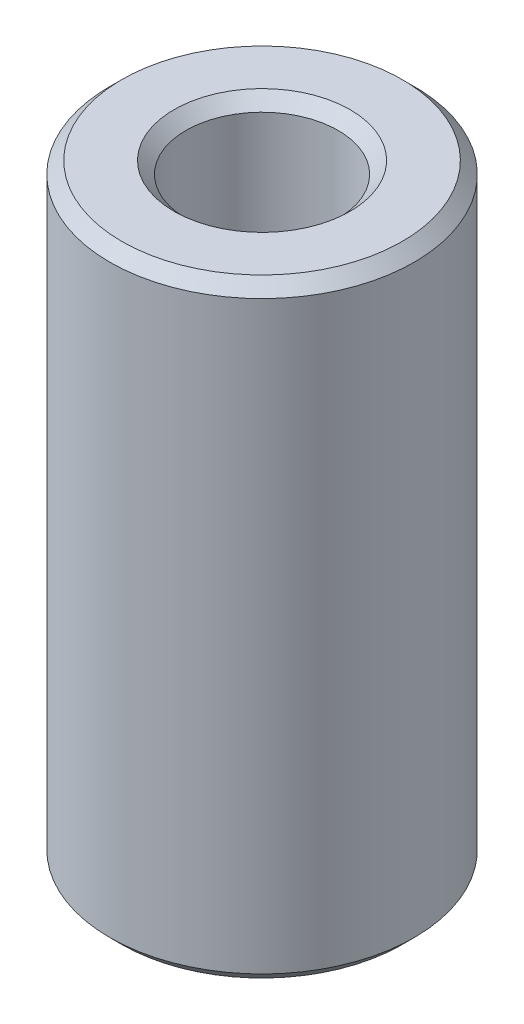
ISO-10303-21;
HEADER;
FILE_DESCRIPTION(('STEP AP214'),'2;1');
FILE_NAME('part.step','',(''),(''),'','','');
FILE_SCHEMA(('AUTOMOTIVE_DESIGN { 1 0 10303 214 1 1 1 1 }'));
ENDSEC;
DATA;
#1=APPLICATION_CONTEXT('core data for automotive mechanical design processes');
#2=APPLICATION_PROTOCOL_DEFINITION('international standard','automotive_design',2000,#1);
#3=PRODUCT_CONTEXT('',#1,'mechanical');
#4=PRODUCT('Part','Part','',(#3));
#5=PRODUCT_RELATED_PRODUCT_CATEGORY('part','',(#4));
#6=PRODUCT_DEFINITION_FORMATION('','',#4);
#7=PRODUCT_DEFINITION_CONTEXT('part definition',#1,'design');
#8=PRODUCT_DEFINITION('design','',#6,#7);
#9=PRODUCT_DEFINITION_SHAPE('','',#8);
#10=(LENGTH_UNIT() NAMED_UNIT(*) SI_UNIT(.MILLI.,.METRE.));
#11=(NAMED_UNIT(*) PLANE_ANGLE_UNIT() SI_UNIT($,.RADIAN.));
#12=(NAMED_UNIT(*) SI_UNIT($,.STERADIAN.) SOLID_ANGLE_UNIT());
#13=UNCERTAINTY_MEASURE_WITH_UNIT(LENGTH_MEASURE(1.E-05),#10,'distance_accuracy_value','');
#14=(GEOMETRIC_REPRESENTATION_CONTEXT(3) GLOBAL_UNCERTAINTY_ASSIGNED_CONTEXT((#13)) GLOBAL_UNIT_ASSIGNED_CONTEXT((#10,
#11,#12)) REPRESENTATION_CONTEXT('',''));
#15=CARTESIAN_POINT('',(0.,0.,0.));
#16=DIRECTION('',(0.,0.,1.));
#17=DIRECTION('',(1.,0.,0.));
#18=AXIS2_PLACEMENT_3D('',#15,#16,#17);
#19=CARTESIAN_POINT('',(0.,25.4,0.));
#20=DIRECTION('',(0.,1.,0.));
#21=DIRECTION('',(0.,0.,1.));
#22=AXIS2_PLACEMENT_3D('',#19,#20,#21);
#23=PLANE('',#22);
#24=CARTESIAN_POINT('',(0.,25.4,0.));
#25=DIRECTION('',(0.,1.,0.));
#26=DIRECTION('',(0.,0.,1.));
#27=AXIS2_PLACEMENT_3D('',#24,#25,#26);
#28=CIRCLE('',#27,5.85);
#29=CARTESIAN_POINT('',(0.,25.4,5.85));
#30=VERTEX_POINT('',#29);
#31=EDGE_CURVE('E10',#30,#30,#28,.T.);
#32=ORIENTED_EDGE('',*,*,#31,.T.);
#33=EDGE_LOOP('',(#32));
#34=FACE_BOUND('',#33,.T.);
#35=CARTESIAN_POINT('',(0.,25.4,0.));
#36=DIRECTION('',(0.,1.,0.));
#37=DIRECTION('',(0.,0.,1.));
#38=AXIS2_PLACEMENT_3D('',#35,#36,#37);
#39=CIRCLE('',#38,3.67500000000001);
#40=CARTESIAN_POINT('',(0.,25.4,3.67500000000001));
#41=VERTEX_POINT('',#40);
#42=EDGE_CURVE('E55',#41,#41,#39,.F.);
#43=ORIENTED_EDGE('',*,*,#42,.T.);
#44=EDGE_LOOP('',(#43));
#45=FACE_BOUND('',#44,.T.);
#46=ADVANCED_FACE('F47',(#34,#45),#23,.T.);
#47=CARTESIAN_POINT('',(0.,0.,0.));
#48=DIRECTION('',(0.,1.,0.));
#49=DIRECTION('',(0.,0.,1.));
#50=AXIS2_PLACEMENT_3D('',#47,#48,#49);
#51=PLANE('',#50);
#52=CARTESIAN_POINT('',(0.,0.,0.));
#53=DIRECTION('',(0.,1.,0.));
#54=DIRECTION('',(0.,0.,1.));
#55=AXIS2_PLACEMENT_3D('',#52,#53,#54);
#56=CIRCLE('',#55,5.85);
#57=CARTESIAN_POINT('',(0.,0.,5.85));
#58=VERTEX_POINT('',#57);
#59=EDGE_CURVE('E68',#58,#58,#56,.F.);
#60=ORIENTED_EDGE('',*,*,#59,.T.);
#61=EDGE_LOOP('',(#60));
#62=FACE_BOUND('',#61,.T.);
#63=CARTESIAN_POINT('',(0.,0.,0.));
#64=DIRECTION('',(0.,1.,0.));
#65=DIRECTION('',(0.,0.,1.));
#66=AXIS2_PLACEMENT_3D('',#63,#64,#65);
#67=CIRCLE('',#66,3.67499999999999);
#68=CARTESIAN_POINT('',(0.,0.,3.67499999999999));
#69=VERTEX_POINT('',#68);
#70=EDGE_CURVE('E71',#69,#69,#67,.T.);
#71=ORIENTED_EDGE('',*,*,#70,.T.);
#72=EDGE_LOOP('',(#71));
#73=FACE_BOUND('',#72,.T.);
#74=ADVANCED_FACE('F97',(#62,#73),#51,.F.);
#75=CARTESIAN_POINT('',(0.,25.4,0.));
#76=DIRECTION('',(0.,-1.,0.));
#77=DIRECTION('',(0.,0.,-1.));
#78=AXIS2_PLACEMENT_3D('',#75,#76,#77);
#79=CYLINDRICAL_SURFACE('',#78,6.35);
#80=CARTESIAN_POINT('',(0.,0.5,0.));
#81=DIRECTION('',(0.,1.,0.));
#82=DIRECTION('',(0.,0.,1.));
#83=AXIS2_PLACEMENT_3D('',#80,#81,#82);
#84=CIRCLE('',#83,6.35);
#85=CARTESIAN_POINT('',(0.,0.5,6.35));
#86=VERTEX_POINT('',#85);
#87=EDGE_CURVE('E74',#86,#86,#84,.T.);
#88=ORIENTED_EDGE('',*,*,#87,.T.);
#89=EDGE_LOOP('',(#88));
#90=FACE_BOUND('',#89,.T.);
#91=CARTESIAN_POINT('',(0.,24.9,0.));
#92=DIRECTION('',(0.,1.,0.));
#93=DIRECTION('',(0.,0.,1.));
#94=AXIS2_PLACEMENT_3D('',#91,#92,#93);
#95=CIRCLE('',#94,6.35);
#96=CARTESIAN_POINT('',(0.,24.9,6.35));
#97=VERTEX_POINT('',#96);
#98=EDGE_CURVE('E77',#97,#97,#95,.F.);
#99=ORIENTED_EDGE('',*,*,#98,.T.);
#100=EDGE_LOOP('',(#99));
#101=FACE_BOUND('',#100,.T.);
#102=ADVANCED_FACE('F81',(#90,#101),#79,.T.);
#103=CARTESIAN_POINT('',(0.,25.4,0.));
#104=DIRECTION('',(0.,-1.,0.));
#105=DIRECTION('',(0.,0.,-1.));
#106=AXIS2_PLACEMENT_3D('',#103,#104,#105);
#107=CYLINDRICAL_SURFACE('',#106,3.175);
#108=CARTESIAN_POINT('',(0.,0.499999999999997,0.));
#109=DIRECTION('',(0.,1.,0.));
#110=DIRECTION('',(0.,0.,1.));
#111=AXIS2_PLACEMENT_3D('',#108,#109,#110);
#112=CIRCLE('',#111,3.175);
#113=CARTESIAN_POINT('',(0.,0.499999999999997,3.175));
#114=VERTEX_POINT('',#113);
#115=EDGE_CURVE('E59',#114,#114,#112,.F.);
#116=ORIENTED_EDGE('',*,*,#115,.T.);
#117=EDGE_LOOP('',(#116));
#118=FACE_BOUND('',#117,.T.);
#119=CARTESIAN_POINT('',(0.,24.9,0.));
#120=DIRECTION('',(0.,1.,0.));
#121=DIRECTION('',(0.,0.,1.));
#122=AXIS2_PLACEMENT_3D('',#119,#120,#121);
#123=CIRCLE('',#122,3.175);
#124=CARTESIAN_POINT('',(0.,24.9,3.175));
#125=VERTEX_POINT('',#124);
#126=EDGE_CURVE('E63',#125,#125,#123,.T.);
#127=ORIENTED_EDGE('',*,*,#126,.T.);
#128=EDGE_LOOP('',(#127));
#129=FACE_BOUND('',#128,.T.);
#130=ADVANCED_FACE('F104',(#118,#129),#107,.F.);
#131=CARTESIAN_POINT('',(0.,0.5,0.));
#132=DIRECTION('',(0.,1.,0.));
#133=DIRECTION('',(0.,0.,1.));
#134=AXIS2_PLACEMENT_3D('',#131,#132,#133);
#135=CONICAL_SURFACE('',#134,6.35,0.785398163397449);
#136=ORIENTED_EDGE('',*,*,#59,.F.);
#137=EDGE_LOOP('',(#136));
#138=FACE_BOUND('',#137,.T.);
#139=ORIENTED_EDGE('',*,*,#87,.F.);
#140=EDGE_LOOP('',(#139));
#141=FACE_BOUND('',#140,.T.);
#142=ADVANCED_FACE('F93',(#138,#141),#135,.T.);
#143=CARTESIAN_POINT('',(0.,0.,0.));
#144=DIRECTION('',(0.,-1.,0.));
#145=DIRECTION('',(0.,0.,-1.));
#146=AXIS2_PLACEMENT_3D('',#143,#144,#145);
#147=CONICAL_SURFACE('',#146,3.67499999999999,0.785398163397446);
#148=ORIENTED_EDGE('',*,*,#115,.F.);
#149=EDGE_LOOP('',(#148));
#150=FACE_BOUND('',#149,.T.);
#151=ORIENTED_EDGE('',*,*,#70,.F.);
#152=EDGE_LOOP('',(#151));
#153=FACE_BOUND('',#152,.T.);
#154=ADVANCED_FACE('F86',(#150,#153),#147,.F.);
#155=CARTESIAN_POINT('',(0.,25.4,0.));
#156=DIRECTION('',(0.,-1.,0.));
#157=DIRECTION('',(0.,0.,-1.));
#158=AXIS2_PLACEMENT_3D('',#155,#156,#157);
#159=CONICAL_SURFACE('',#158,5.85,0.785398163397447);
#160=ORIENTED_EDGE('',*,*,#98,.F.);
#161=EDGE_LOOP('',(#160));
#162=FACE_BOUND('',#161,.T.);
#163=ORIENTED_EDGE('',*,*,#31,.F.);
#164=EDGE_LOOP('',(#163));
#165=FACE_BOUND('',#164,.T.);
#166=ADVANCED_FACE('F83',(#162,#165),#159,.T.);
#167=CARTESIAN_POINT('',(0.,24.9,0.));
#168=DIRECTION('',(0.,1.,0.));
#169=DIRECTION('',(0.,0.,1.));
#170=AXIS2_PLACEMENT_3D('',#167,#168,#169);
#171=CONICAL_SURFACE('',#170,3.175,0.785398163397452);
#172=ORIENTED_EDGE('',*,*,#42,.F.);
#173=EDGE_LOOP('',(#172));
#174=FACE_BOUND('',#173,.T.);
#175=ORIENTED_EDGE('',*,*,#126,.F.);
#176=EDGE_LOOP('',(#175));
#177=FACE_BOUND('',#176,.T.);
#178=ADVANCED_FACE('F50',(#174,#177),#171,.F.);
#179=CLOSED_SHELL('',(#46,#74,#102,#130,#142,#154,#166,#178));
#180=MANIFOLD_SOLID_BREP('B2',#179);
#181=ADVANCED_BREP_SHAPE_REPRESENTATION('',(#18,#180),#14);
#182=SHAPE_DEFINITION_REPRESENTATION(#9,#181);
ENDSEC;
END-ISO-10303-21;
